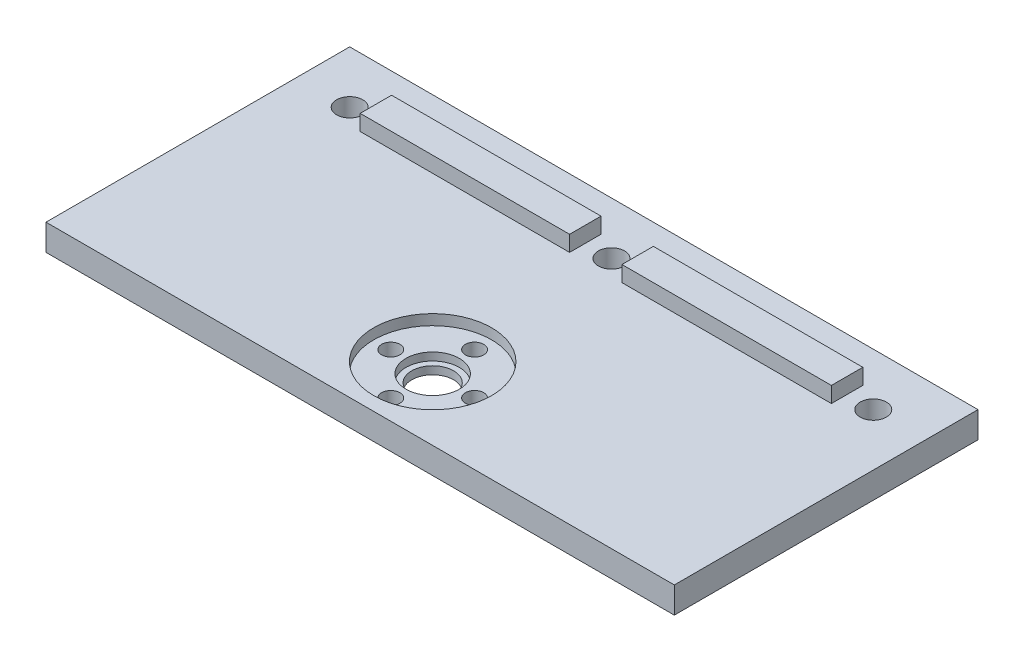
ISO-10303-21;
HEADER;
FILE_DESCRIPTION(('STEP AP214'),'2;1');
FILE_NAME('part.step','',(''),(''),'','','');
FILE_SCHEMA(('AUTOMOTIVE_DESIGN { 1 0 10303 214 1 1 1 1 }'));
ENDSEC;
DATA;
#1=APPLICATION_CONTEXT('core data for automotive mechanical design processes');
#2=APPLICATION_PROTOCOL_DEFINITION('international standard','automotive_design',2000,#1);
#3=PRODUCT_CONTEXT('',#1,'mechanical');
#4=PRODUCT('Part','Part','',(#3));
#5=PRODUCT_RELATED_PRODUCT_CATEGORY('part','',(#4));
#6=PRODUCT_DEFINITION_FORMATION('','',#4);
#7=PRODUCT_DEFINITION_CONTEXT('part definition',#1,'design');
#8=PRODUCT_DEFINITION('design','',#6,#7);
#9=PRODUCT_DEFINITION_SHAPE('','',#8);
#10=(LENGTH_UNIT() NAMED_UNIT(*) SI_UNIT(.MILLI.,.METRE.));
#11=(NAMED_UNIT(*) PLANE_ANGLE_UNIT() SI_UNIT($,.RADIAN.));
#12=(NAMED_UNIT(*) SI_UNIT($,.STERADIAN.) SOLID_ANGLE_UNIT());
#13=UNCERTAINTY_MEASURE_WITH_UNIT(LENGTH_MEASURE(1.E-05),#10,'distance_accuracy_value','');
#14=(GEOMETRIC_REPRESENTATION_CONTEXT(3) GLOBAL_UNCERTAINTY_ASSIGNED_CONTEXT((#13)) GLOBAL_UNIT_ASSIGNED_CONTEXT((#10,
#11,#12)) REPRESENTATION_CONTEXT('',''));
#15=CARTESIAN_POINT('',(0.,0.,0.));
#16=DIRECTION('',(0.,0.,1.));
#17=DIRECTION('',(1.,0.,0.));
#18=AXIS2_PLACEMENT_3D('',#15,#16,#17);
#19=CARTESIAN_POINT('',(60.,-9.,-13.85));
#20=DIRECTION('',(0.,1.,0.));
#21=DIRECTION('',(0.,0.,1.));
#22=AXIS2_PLACEMENT_3D('',#19,#20,#21);
#23=CYLINDRICAL_SURFACE('',#22,4.00000000000001);
#24=CARTESIAN_POINT('',(60.,0.,-13.85));
#25=DIRECTION('',(0.,-1.,0.));
#26=DIRECTION('',(0.,0.,-1.));
#27=AXIS2_PLACEMENT_3D('',#24,#25,#26);
#28=CIRCLE('',#27,4.00000000000001);
#29=CARTESIAN_POINT('',(60.,0.,-17.85));
#30=VERTEX_POINT('',#29);
#31=EDGE_CURVE('E226',#30,#30,#28,.T.);
#32=ORIENTED_EDGE('',*,*,#31,.T.);
#33=EDGE_LOOP('',(#32));
#34=FACE_BOUND('',#33,.T.);
#35=CARTESIAN_POINT('',(60.,1.5,-13.85));
#36=DIRECTION('',(0.,1.,0.));
#37=DIRECTION('',(0.,0.,1.));
#38=AXIS2_PLACEMENT_3D('',#35,#36,#37);
#39=CIRCLE('',#38,4.00000000000001);
#40=CARTESIAN_POINT('',(60.,1.5,-9.84999999999999));
#41=VERTEX_POINT('',#40);
#42=EDGE_CURVE('E37',#41,#41,#39,.F.);
#43=ORIENTED_EDGE('',*,*,#42,.F.);
#44=EDGE_LOOP('',(#43));
#45=FACE_BOUND('',#44,.T.);
#46=ADVANCED_FACE('F33',(#34,#45),#23,.F.);
#47=CARTESIAN_POINT('',(0.,5.,0.));
#48=DIRECTION('',(0.,-1.,0.));
#49=DIRECTION('',(0.,0.,-1.));
#50=AXIS2_PLACEMENT_3D('',#47,#48,#49);
#51=PLANE('',#50);
#52=CARTESIAN_POINT('',(60.,5.,-13.85));
#53=DIRECTION('',(0.,1.,0.));
#54=DIRECTION('',(0.,0.,1.));
#55=AXIS2_PLACEMENT_3D('',#52,#53,#54);
#56=CIRCLE('',#55,11.25);
#57=CARTESIAN_POINT('',(60.,5.,-2.60000000000001));
#58=VERTEX_POINT('',#57);
#59=EDGE_CURVE('E228',#58,#58,#56,.T.);
#60=ORIENTED_EDGE('',*,*,#59,.F.);
#61=EDGE_LOOP('',(#60));
#62=FACE_BOUND('',#61,.T.);
#63=DIRECTION('',(0.,0.,1.));
#64=VECTOR('',#63,1.);
#65=CARTESIAN_POINT('',(15.,5.,-45.));
#66=LINE('',#65,#64);
#67=CARTESIAN_POINT('',(15.,5.,-51.));
#68=VERTEX_POINT('',#67);
#69=CARTESIAN_POINT('',(15.,5.,-45.));
#70=VERTEX_POINT('',#69);
#71=EDGE_CURVE('E145',#68,#70,#66,.T.);
#72=ORIENTED_EDGE('',*,*,#71,.F.);
#73=DIRECTION('',(-1.,0.,0.));
#74=VECTOR('',#73,1.);
#75=CARTESIAN_POINT('',(15.,5.,-51.));
#76=LINE('',#75,#74);
#77=CARTESIAN_POINT('',(55.,5.,-51.));
#78=VERTEX_POINT('',#77);
#79=EDGE_CURVE('E158',#78,#68,#76,.T.);
#80=ORIENTED_EDGE('',*,*,#79,.F.);
#81=DIRECTION('',(0.,0.,-1.));
#82=VECTOR('',#81,1.);
#83=CARTESIAN_POINT('',(55.,5.,-45.));
#84=LINE('',#83,#82);
#85=CARTESIAN_POINT('',(55.,5.,-45.));
#86=VERTEX_POINT('',#85);
#87=EDGE_CURVE('E167',#86,#78,#84,.T.);
#88=ORIENTED_EDGE('',*,*,#87,.F.);
#89=DIRECTION('',(1.,0.,0.));
#90=VECTOR('',#89,1.);
#91=CARTESIAN_POINT('',(15.,5.,-45.));
#92=LINE('',#91,#90);
#93=EDGE_CURVE('E148',#70,#86,#92,.T.);
#94=ORIENTED_EDGE('',*,*,#93,.F.);
#95=EDGE_LOOP('',(#72,#80,#88,#94));
#96=FACE_BOUND('',#95,.T.);
#97=CARTESIAN_POINT('',(10.,5.,-48.));
#98=DIRECTION('',(0.,1.,0.));
#99=DIRECTION('',(0.,0.,1.));
#100=AXIS2_PLACEMENT_3D('',#97,#98,#99);
#101=CIRCLE('',#100,2.5);
#102=CARTESIAN_POINT('',(10.,5.,-45.5));
#103=VERTEX_POINT('',#102);
#104=EDGE_CURVE('E188',#103,#103,#101,.T.);
#105=ORIENTED_EDGE('',*,*,#104,.F.);
#106=EDGE_LOOP('',(#105));
#107=FACE_BOUND('',#106,.T.);
#108=CARTESIAN_POINT('',(60.,5.,-48.));
#109=DIRECTION('',(0.,1.,0.));
#110=DIRECTION('',(0.,0.,1.));
#111=AXIS2_PLACEMENT_3D('',#108,#109,#110);
#112=CIRCLE('',#111,2.5);
#113=CARTESIAN_POINT('',(60.,5.,-45.5));
#114=VERTEX_POINT('',#113);
#115=EDGE_CURVE('E194',#114,#114,#112,.T.);
#116=ORIENTED_EDGE('',*,*,#115,.F.);
#117=EDGE_LOOP('',(#116));
#118=FACE_BOUND('',#117,.T.);
#119=CARTESIAN_POINT('',(110.,5.,-48.));
#120=DIRECTION('',(0.,1.,0.));
#121=DIRECTION('',(0.,0.,1.));
#122=AXIS2_PLACEMENT_3D('',#119,#120,#121);
#123=CIRCLE('',#122,2.50000000000001);
#124=CARTESIAN_POINT('',(110.,5.,-45.5));
#125=VERTEX_POINT('',#124);
#126=EDGE_CURVE('E183',#125,#125,#123,.T.);
#127=ORIENTED_EDGE('',*,*,#126,.F.);
#128=EDGE_LOOP('',(#127));
#129=FACE_BOUND('',#128,.T.);
#130=DIRECTION('',(0.,0.,1.));
#131=VECTOR('',#130,1.);
#132=CARTESIAN_POINT('',(0.,5.,0.));
#133=LINE('',#132,#131);
#134=CARTESIAN_POINT('',(0.,5.,-58.));
#135=VERTEX_POINT('',#134);
#136=CARTESIAN_POINT('',(0.,5.,0.));
#137=VERTEX_POINT('',#136);
#138=EDGE_CURVE('E202',#135,#137,#133,.T.);
#139=ORIENTED_EDGE('',*,*,#138,.T.);
#140=DIRECTION('',(1.,0.,0.));
#141=VECTOR('',#140,1.);
#142=CARTESIAN_POINT('',(0.,5.,0.));
#143=LINE('',#142,#141);
#144=CARTESIAN_POINT('',(120.,5.,0.));
#145=VERTEX_POINT('',#144);
#146=EDGE_CURVE('E205',#137,#145,#143,.T.);
#147=ORIENTED_EDGE('',*,*,#146,.T.);
#148=DIRECTION('',(0.,0.,-1.));
#149=VECTOR('',#148,1.);
#150=CARTESIAN_POINT('',(120.,5.,0.));
#151=LINE('',#150,#149);
#152=CARTESIAN_POINT('',(120.,5.,-58.));
#153=VERTEX_POINT('',#152);
#154=EDGE_CURVE('E208',#145,#153,#151,.T.);
#155=ORIENTED_EDGE('',*,*,#154,.T.);
#156=DIRECTION('',(-1.,0.,0.));
#157=VECTOR('',#156,1.);
#158=CARTESIAN_POINT('',(0.,5.,-58.));
#159=LINE('',#158,#157);
#160=EDGE_CURVE('E210',#153,#135,#159,.T.);
#161=ORIENTED_EDGE('',*,*,#160,.T.);
#162=EDGE_LOOP('',(#139,#147,#155,#161));
#163=FACE_BOUND('',#162,.T.);
#164=DIRECTION('',(0.,0.,1.));
#165=VECTOR('',#164,1.);
#166=CARTESIAN_POINT('',(65.,5.,-45.));
#167=LINE('',#166,#165);
#168=CARTESIAN_POINT('',(65.,5.,-51.));
#169=VERTEX_POINT('',#168);
#170=CARTESIAN_POINT('',(65.,5.,-45.));
#171=VERTEX_POINT('',#170);
#172=EDGE_CURVE('E144',#169,#171,#167,.T.);
#173=ORIENTED_EDGE('',*,*,#172,.F.);
#174=DIRECTION('',(-1.,0.,0.));
#175=VECTOR('',#174,1.);
#176=CARTESIAN_POINT('',(65.,5.,-51.));
#177=LINE('',#176,#175);
#178=CARTESIAN_POINT('',(105.,5.,-51.));
#179=VERTEX_POINT('',#178);
#180=EDGE_CURVE('E141',#179,#169,#177,.T.);
#181=ORIENTED_EDGE('',*,*,#180,.F.);
#182=DIRECTION('',(0.,0.,-1.));
#183=VECTOR('',#182,1.);
#184=CARTESIAN_POINT('',(105.,5.,-45.));
#185=LINE('',#184,#183);
#186=CARTESIAN_POINT('',(105.,5.,-45.));
#187=VERTEX_POINT('',#186);
#188=EDGE_CURVE('E55',#187,#179,#185,.T.);
#189=ORIENTED_EDGE('',*,*,#188,.F.);
#190=DIRECTION('',(1.,0.,0.));
#191=VECTOR('',#190,1.);
#192=CARTESIAN_POINT('',(65.,5.,-45.));
#193=LINE('',#192,#191);
#194=EDGE_CURVE('E50',#171,#187,#193,.T.);
#195=ORIENTED_EDGE('',*,*,#194,.F.);
#196=EDGE_LOOP('',(#173,#181,#189,#195));
#197=FACE_BOUND('',#196,.T.);
#198=ADVANCED_FACE('F274',(#62,#96,#107,#118,#129,#163,#197),#51,.F.);
#199=CARTESIAN_POINT('',(0.,5.,0.));
#200=DIRECTION('',(1.,0.,0.));
#201=DIRECTION('',(0.,0.,-1.));
#202=AXIS2_PLACEMENT_3D('',#199,#200,#201);
#203=PLANE('',#202);
#204=DIRECTION('',(0.,0.,1.));
#205=VECTOR('',#204,1.);
#206=CARTESIAN_POINT('',(0.,0.,0.));
#207=LINE('',#206,#205);
#208=CARTESIAN_POINT('',(0.,0.,-58.));
#209=VERTEX_POINT('',#208);
#210=CARTESIAN_POINT('',(0.,0.,0.));
#211=VERTEX_POINT('',#210);
#212=EDGE_CURVE('E187',#209,#211,#207,.T.);
#213=ORIENTED_EDGE('',*,*,#212,.T.);
#214=DIRECTION('',(0.,-1.,0.));
#215=VECTOR('',#214,1.);
#216=CARTESIAN_POINT('',(0.,5.,0.));
#217=LINE('',#216,#215);
#218=EDGE_CURVE('E11',#137,#211,#217,.T.);
#219=ORIENTED_EDGE('',*,*,#218,.F.);
#220=ORIENTED_EDGE('',*,*,#138,.F.);
#221=DIRECTION('',(0.,-1.,0.));
#222=VECTOR('',#221,1.);
#223=CARTESIAN_POINT('',(0.,5.,-58.));
#224=LINE('',#223,#222);
#225=EDGE_CURVE('E212',#135,#209,#224,.T.);
#226=ORIENTED_EDGE('',*,*,#225,.T.);
#227=EDGE_LOOP('',(#213,#219,#220,#226));
#228=FACE_BOUND('',#227,.T.);
#229=ADVANCED_FACE('F35',(#228),#203,.F.);
#230=CARTESIAN_POINT('',(0.,5.,0.));
#231=DIRECTION('',(0.,0.,-1.));
#232=DIRECTION('',(-1.,0.,0.));
#233=AXIS2_PLACEMENT_3D('',#230,#231,#232);
#234=PLANE('',#233);
#235=DIRECTION('',(1.,0.,0.));
#236=VECTOR('',#235,1.);
#237=CARTESIAN_POINT('',(0.,0.,0.));
#238=LINE('',#237,#236);
#239=CARTESIAN_POINT('',(120.,0.,0.));
#240=VERTEX_POINT('',#239);
#241=EDGE_CURVE('E215',#211,#240,#238,.T.);
#242=ORIENTED_EDGE('',*,*,#241,.T.);
#243=DIRECTION('',(0.,-1.,0.));
#244=VECTOR('',#243,1.);
#245=CARTESIAN_POINT('',(120.,5.,0.));
#246=LINE('',#245,#244);
#247=EDGE_CURVE('E42',#145,#240,#246,.T.);
#248=ORIENTED_EDGE('',*,*,#247,.F.);
#249=ORIENTED_EDGE('',*,*,#146,.F.);
#250=ORIENTED_EDGE('',*,*,#218,.T.);
#251=EDGE_LOOP('',(#242,#248,#249,#250));
#252=FACE_BOUND('',#251,.T.);
#253=ADVANCED_FACE('F497',(#252),#234,.F.);
#254=CARTESIAN_POINT('',(120.,5.,0.));
#255=DIRECTION('',(-1.,0.,0.));
#256=DIRECTION('',(0.,0.,1.));
#257=AXIS2_PLACEMENT_3D('',#254,#255,#256);
#258=PLANE('',#257);
#259=DIRECTION('',(0.,0.,-1.));
#260=VECTOR('',#259,1.);
#261=CARTESIAN_POINT('',(120.,0.,0.));
#262=LINE('',#261,#260);
#263=CARTESIAN_POINT('',(120.,0.,-58.));
#264=VERTEX_POINT('',#263);
#265=EDGE_CURVE('E217',#240,#264,#262,.T.);
#266=ORIENTED_EDGE('',*,*,#265,.T.);
#267=DIRECTION('',(0.,-1.,0.));
#268=VECTOR('',#267,1.);
#269=CARTESIAN_POINT('',(120.,5.,-58.));
#270=LINE('',#269,#268);
#271=EDGE_CURVE('E222',#153,#264,#270,.T.);
#272=ORIENTED_EDGE('',*,*,#271,.F.);
#273=ORIENTED_EDGE('',*,*,#154,.F.);
#274=ORIENTED_EDGE('',*,*,#247,.T.);
#275=EDGE_LOOP('',(#266,#272,#273,#274));
#276=FACE_BOUND('',#275,.T.);
#277=ADVANCED_FACE('F488',(#276),#258,.F.);
#278=CARTESIAN_POINT('',(0.,5.,-58.));
#279=DIRECTION('',(0.,0.,1.));
#280=DIRECTION('',(1.,0.,0.));
#281=AXIS2_PLACEMENT_3D('',#278,#279,#280);
#282=PLANE('',#281);
#283=DIRECTION('',(-1.,0.,0.));
#284=VECTOR('',#283,1.);
#285=CARTESIAN_POINT('',(0.,0.,-58.));
#286=LINE('',#285,#284);
#287=EDGE_CURVE('E206',#264,#209,#286,.T.);
#288=ORIENTED_EDGE('',*,*,#287,.T.);
#289=ORIENTED_EDGE('',*,*,#225,.F.);
#290=ORIENTED_EDGE('',*,*,#160,.F.);
#291=ORIENTED_EDGE('',*,*,#271,.T.);
#292=EDGE_LOOP('',(#288,#289,#290,#291));
#293=FACE_BOUND('',#292,.T.);
#294=ADVANCED_FACE('F480',(#293),#282,.F.);
#295=CARTESIAN_POINT('',(0.,0.,0.));
#296=DIRECTION('',(0.,-1.,0.));
#297=DIRECTION('',(0.,0.,-1.));
#298=AXIS2_PLACEMENT_3D('',#295,#296,#297);
#299=PLANE('',#298);
#300=CARTESIAN_POINT('',(52.,0.,-13.85));
#301=DIRECTION('',(0.,-1.,0.));
#302=DIRECTION('',(0.,0.,-1.));
#303=AXIS2_PLACEMENT_3D('',#300,#301,#302);
#304=CIRCLE('',#303,1.75);
#305=CARTESIAN_POINT('',(52.,0.,-15.6));
#306=VERTEX_POINT('',#305);
#307=EDGE_CURVE('E244',#306,#306,#304,.T.);
#308=ORIENTED_EDGE('',*,*,#307,.F.);
#309=EDGE_LOOP('',(#308));
#310=FACE_BOUND('',#309,.T.);
#311=CARTESIAN_POINT('',(60.,0.,-21.85));
#312=DIRECTION('',(0.,-1.,0.));
#313=DIRECTION('',(0.,0.,-1.));
#314=AXIS2_PLACEMENT_3D('',#311,#312,#313);
#315=CIRCLE('',#314,1.75);
#316=CARTESIAN_POINT('',(60.,0.,-23.6));
#317=VERTEX_POINT('',#316);
#318=EDGE_CURVE('E548',#317,#317,#315,.T.);
#319=ORIENTED_EDGE('',*,*,#318,.F.);
#320=EDGE_LOOP('',(#319));
#321=FACE_BOUND('',#320,.T.);
#322=CARTESIAN_POINT('',(68.,0.,-13.85));
#323=DIRECTION('',(0.,-1.,0.));
#324=DIRECTION('',(0.,0.,-1.));
#325=AXIS2_PLACEMENT_3D('',#322,#323,#324);
#326=CIRCLE('',#325,1.75);
#327=CARTESIAN_POINT('',(68.,0.,-15.6));
#328=VERTEX_POINT('',#327);
#329=EDGE_CURVE('E552',#328,#328,#326,.T.);
#330=ORIENTED_EDGE('',*,*,#329,.F.);
#331=EDGE_LOOP('',(#330));
#332=FACE_BOUND('',#331,.T.);
#333=CARTESIAN_POINT('',(60.,0.,-5.85));
#334=DIRECTION('',(0.,-1.,0.));
#335=DIRECTION('',(0.,0.,-1.));
#336=AXIS2_PLACEMENT_3D('',#333,#334,#335);
#337=CIRCLE('',#336,1.75);
#338=CARTESIAN_POINT('',(60.,0.,-7.6));
#339=VERTEX_POINT('',#338);
#340=EDGE_CURVE('E556',#339,#339,#337,.T.);
#341=ORIENTED_EDGE('',*,*,#340,.F.);
#342=EDGE_LOOP('',(#341));
#343=FACE_BOUND('',#342,.T.);
#344=ORIENTED_EDGE('',*,*,#31,.F.);
#345=EDGE_LOOP('',(#344));
#346=FACE_BOUND('',#345,.T.);
#347=CARTESIAN_POINT('',(10.,0.,-48.));
#348=DIRECTION('',(0.,1.,0.));
#349=DIRECTION('',(0.,0.,1.));
#350=AXIS2_PLACEMENT_3D('',#347,#348,#349);
#351=CIRCLE('',#350,2.5);
#352=CARTESIAN_POINT('',(10.,0.,-45.5));
#353=VERTEX_POINT('',#352);
#354=EDGE_CURVE('E184',#353,#353,#351,.T.);
#355=ORIENTED_EDGE('',*,*,#354,.T.);
#356=EDGE_LOOP('',(#355));
#357=FACE_BOUND('',#356,.T.);
#358=CARTESIAN_POINT('',(60.,0.,-48.));
#359=DIRECTION('',(0.,1.,0.));
#360=DIRECTION('',(0.,0.,1.));
#361=AXIS2_PLACEMENT_3D('',#358,#359,#360);
#362=CIRCLE('',#361,2.5);
#363=CARTESIAN_POINT('',(60.,0.,-45.5));
#364=VERTEX_POINT('',#363);
#365=EDGE_CURVE('E191',#364,#364,#362,.T.);
#366=ORIENTED_EDGE('',*,*,#365,.T.);
#367=EDGE_LOOP('',(#366));
#368=FACE_BOUND('',#367,.T.);
#369=CARTESIAN_POINT('',(110.,0.,-48.));
#370=DIRECTION('',(0.,1.,0.));
#371=DIRECTION('',(0.,0.,1.));
#372=AXIS2_PLACEMENT_3D('',#369,#370,#371);
#373=CIRCLE('',#372,2.50000000000001);
#374=CARTESIAN_POINT('',(110.,0.,-45.5));
#375=VERTEX_POINT('',#374);
#376=EDGE_CURVE('E197',#375,#375,#373,.T.);
#377=ORIENTED_EDGE('',*,*,#376,.T.);
#378=EDGE_LOOP('',(#377));
#379=FACE_BOUND('',#378,.T.);
#380=ORIENTED_EDGE('',*,*,#212,.F.);
#381=ORIENTED_EDGE('',*,*,#287,.F.);
#382=ORIENTED_EDGE('',*,*,#265,.F.);
#383=ORIENTED_EDGE('',*,*,#241,.F.);
#384=EDGE_LOOP('',(#380,#381,#382,#383));
#385=FACE_BOUND('',#384,.T.);
#386=ADVANCED_FACE('F471',(#310,#321,#332,#343,#346,#357,#368,#379,#385),#299,.T.);
#387=CARTESIAN_POINT('',(110.,0.,-48.));
#388=DIRECTION('',(0.,1.,0.));
#389=DIRECTION('',(0.,0.,1.));
#390=AXIS2_PLACEMENT_3D('',#387,#388,#389);
#391=CYLINDRICAL_SURFACE('',#390,2.50000000000001);
#392=ORIENTED_EDGE('',*,*,#376,.F.);
#393=EDGE_LOOP('',(#392));
#394=FACE_BOUND('',#393,.T.);
#395=ORIENTED_EDGE('',*,*,#126,.T.);
#396=EDGE_LOOP('',(#395));
#397=FACE_BOUND('',#396,.T.);
#398=ADVANCED_FACE('F462',(#394,#397),#391,.F.);
#399=CARTESIAN_POINT('',(60.,0.,-48.));
#400=DIRECTION('',(0.,1.,0.));
#401=DIRECTION('',(0.,0.,1.));
#402=AXIS2_PLACEMENT_3D('',#399,#400,#401);
#403=CYLINDRICAL_SURFACE('',#402,2.5);
#404=ORIENTED_EDGE('',*,*,#365,.F.);
#405=EDGE_LOOP('',(#404));
#406=FACE_BOUND('',#405,.T.);
#407=ORIENTED_EDGE('',*,*,#115,.T.);
#408=EDGE_LOOP('',(#407));
#409=FACE_BOUND('',#408,.T.);
#410=ADVANCED_FACE('F453',(#406,#409),#403,.F.);
#411=CARTESIAN_POINT('',(10.,0.,-48.));
#412=DIRECTION('',(0.,1.,0.));
#413=DIRECTION('',(0.,0.,1.));
#414=AXIS2_PLACEMENT_3D('',#411,#412,#413);
#415=CYLINDRICAL_SURFACE('',#414,2.5);
#416=ORIENTED_EDGE('',*,*,#354,.F.);
#417=EDGE_LOOP('',(#416));
#418=FACE_BOUND('',#417,.T.);
#419=ORIENTED_EDGE('',*,*,#104,.T.);
#420=EDGE_LOOP('',(#419));
#421=FACE_BOUND('',#420,.T.);
#422=ADVANCED_FACE('F440',(#418,#421),#415,.F.);
#423=CARTESIAN_POINT('',(15.,8.,-45.));
#424=DIRECTION('',(1.,0.,0.));
#425=DIRECTION('',(0.,0.,-1.));
#426=AXIS2_PLACEMENT_3D('',#423,#424,#425);
#427=PLANE('',#426);
#428=ORIENTED_EDGE('',*,*,#71,.T.);
#429=DIRECTION('',(0.,-1.,0.));
#430=VECTOR('',#429,1.);
#431=CARTESIAN_POINT('',(15.,8.,-45.));
#432=LINE('',#431,#430);
#433=CARTESIAN_POINT('',(15.,8.,-45.));
#434=VERTEX_POINT('',#433);
#435=EDGE_CURVE('E180',#434,#70,#432,.T.);
#436=ORIENTED_EDGE('',*,*,#435,.F.);
#437=DIRECTION('',(0.,0.,1.));
#438=VECTOR('',#437,1.);
#439=CARTESIAN_POINT('',(15.,8.,-45.));
#440=LINE('',#439,#438);
#441=CARTESIAN_POINT('',(15.,8.,-51.));
#442=VERTEX_POINT('',#441);
#443=EDGE_CURVE('E154',#442,#434,#440,.T.);
#444=ORIENTED_EDGE('',*,*,#443,.F.);
#445=DIRECTION('',(0.,-1.,0.));
#446=VECTOR('',#445,1.);
#447=CARTESIAN_POINT('',(15.,8.,-51.));
#448=LINE('',#447,#446);
#449=EDGE_CURVE('E163',#442,#68,#448,.T.);
#450=ORIENTED_EDGE('',*,*,#449,.T.);
#451=EDGE_LOOP('',(#428,#436,#444,#450));
#452=FACE_BOUND('',#451,.T.);
#453=ADVANCED_FACE('F431',(#452),#427,.F.);
#454=CARTESIAN_POINT('',(15.,8.,-45.));
#455=DIRECTION('',(0.,0.,-1.));
#456=DIRECTION('',(-1.,0.,0.));
#457=AXIS2_PLACEMENT_3D('',#454,#455,#456);
#458=PLANE('',#457);
#459=ORIENTED_EDGE('',*,*,#93,.T.);
#460=DIRECTION('',(0.,-1.,0.));
#461=VECTOR('',#460,1.);
#462=CARTESIAN_POINT('',(55.,8.,-45.));
#463=LINE('',#462,#461);
#464=CARTESIAN_POINT('',(55.,8.,-45.));
#465=VERTEX_POINT('',#464);
#466=EDGE_CURVE('E177',#465,#86,#463,.T.);
#467=ORIENTED_EDGE('',*,*,#466,.F.);
#468=DIRECTION('',(1.,0.,0.));
#469=VECTOR('',#468,1.);
#470=CARTESIAN_POINT('',(15.,8.,-45.));
#471=LINE('',#470,#469);
#472=EDGE_CURVE('E157',#434,#465,#471,.T.);
#473=ORIENTED_EDGE('',*,*,#472,.F.);
#474=ORIENTED_EDGE('',*,*,#435,.T.);
#475=EDGE_LOOP('',(#459,#467,#473,#474));
#476=FACE_BOUND('',#475,.T.);
#477=ADVANCED_FACE('F422',(#476),#458,.F.);
#478=CARTESIAN_POINT('',(55.,8.,-45.));
#479=DIRECTION('',(-1.,0.,0.));
#480=DIRECTION('',(0.,0.,1.));
#481=AXIS2_PLACEMENT_3D('',#478,#479,#480);
#482=PLANE('',#481);
#483=ORIENTED_EDGE('',*,*,#87,.T.);
#484=DIRECTION('',(0.,-1.,0.));
#485=VECTOR('',#484,1.);
#486=CARTESIAN_POINT('',(55.,8.,-51.));
#487=LINE('',#486,#485);
#488=CARTESIAN_POINT('',(55.,8.,-51.));
#489=VERTEX_POINT('',#488);
#490=EDGE_CURVE('E174',#489,#78,#487,.T.);
#491=ORIENTED_EDGE('',*,*,#490,.F.);
#492=DIRECTION('',(0.,0.,-1.));
#493=VECTOR('',#492,1.);
#494=CARTESIAN_POINT('',(55.,8.,-45.));
#495=LINE('',#494,#493);
#496=EDGE_CURVE('E160',#465,#489,#495,.T.);
#497=ORIENTED_EDGE('',*,*,#496,.F.);
#498=ORIENTED_EDGE('',*,*,#466,.T.);
#499=EDGE_LOOP('',(#483,#491,#497,#498));
#500=FACE_BOUND('',#499,.T.);
#501=ADVANCED_FACE('F413',(#500),#482,.F.);
#502=CARTESIAN_POINT('',(15.,8.,-51.));
#503=DIRECTION('',(0.,0.,1.));
#504=DIRECTION('',(1.,0.,0.));
#505=AXIS2_PLACEMENT_3D('',#502,#503,#504);
#506=PLANE('',#505);
#507=ORIENTED_EDGE('',*,*,#79,.T.);
#508=ORIENTED_EDGE('',*,*,#449,.F.);
#509=DIRECTION('',(-1.,0.,0.));
#510=VECTOR('',#509,1.);
#511=CARTESIAN_POINT('',(15.,8.,-51.));
#512=LINE('',#511,#510);
#513=EDGE_CURVE('E162',#489,#442,#512,.T.);
#514=ORIENTED_EDGE('',*,*,#513,.F.);
#515=ORIENTED_EDGE('',*,*,#490,.T.);
#516=EDGE_LOOP('',(#507,#508,#514,#515));
#517=FACE_BOUND('',#516,.T.);
#518=ADVANCED_FACE('F404',(#517),#506,.F.);
#519=CARTESIAN_POINT('',(0.,8.,0.));
#520=DIRECTION('',(0.,-1.,0.));
#521=DIRECTION('',(0.,0.,-1.));
#522=AXIS2_PLACEMENT_3D('',#519,#520,#521);
#523=PLANE('',#522);
#524=ORIENTED_EDGE('',*,*,#443,.T.);
#525=ORIENTED_EDGE('',*,*,#472,.T.);
#526=ORIENTED_EDGE('',*,*,#496,.T.);
#527=ORIENTED_EDGE('',*,*,#513,.T.);
#528=EDGE_LOOP('',(#524,#525,#526,#527));
#529=FACE_BOUND('',#528,.T.);
#530=ADVANCED_FACE('F396',(#529),#523,.F.);
#531=CARTESIAN_POINT('',(65.,8.,-45.));
#532=DIRECTION('',(1.,0.,0.));
#533=DIRECTION('',(0.,0.,-1.));
#534=AXIS2_PLACEMENT_3D('',#531,#532,#533);
#535=PLANE('',#534);
#536=ORIENTED_EDGE('',*,*,#172,.T.);
#537=DIRECTION('',(0.,-1.,0.));
#538=VECTOR('',#537,1.);
#539=CARTESIAN_POINT('',(65.,8.,-45.));
#540=LINE('',#539,#538);
#541=CARTESIAN_POINT('',(65.,8.,-45.));
#542=VERTEX_POINT('',#541);
#543=EDGE_CURVE('E125',#542,#171,#540,.T.);
#544=ORIENTED_EDGE('',*,*,#543,.F.);
#545=DIRECTION('',(0.,0.,1.));
#546=VECTOR('',#545,1.);
#547=CARTESIAN_POINT('',(65.,8.,-45.));
#548=LINE('',#547,#546);
#549=CARTESIAN_POINT('',(65.,8.,-51.));
#550=VERTEX_POINT('',#549);
#551=EDGE_CURVE('E132',#550,#542,#548,.T.);
#552=ORIENTED_EDGE('',*,*,#551,.F.);
#553=DIRECTION('',(0.,-1.,0.));
#554=VECTOR('',#553,1.);
#555=CARTESIAN_POINT('',(65.,8.,-51.));
#556=LINE('',#555,#554);
#557=EDGE_CURVE('E253',#550,#169,#556,.T.);
#558=ORIENTED_EDGE('',*,*,#557,.T.);
#559=EDGE_LOOP('',(#536,#544,#552,#558));
#560=FACE_BOUND('',#559,.T.);
#561=ADVANCED_FACE('F143',(#560),#535,.F.);
#562=CARTESIAN_POINT('',(65.,8.,-45.));
#563=DIRECTION('',(0.,0.,-1.));
#564=DIRECTION('',(-1.,0.,0.));
#565=AXIS2_PLACEMENT_3D('',#562,#563,#564);
#566=PLANE('',#565);
#567=ORIENTED_EDGE('',*,*,#194,.T.);
#568=DIRECTION('',(0.,-1.,0.));
#569=VECTOR('',#568,1.);
#570=CARTESIAN_POINT('',(105.,8.,-45.));
#571=LINE('',#570,#569);
#572=CARTESIAN_POINT('',(105.,8.,-45.));
#573=VERTEX_POINT('',#572);
#574=EDGE_CURVE('E128',#573,#187,#571,.T.);
#575=ORIENTED_EDGE('',*,*,#574,.F.);
#576=DIRECTION('',(1.,0.,0.));
#577=VECTOR('',#576,1.);
#578=CARTESIAN_POINT('',(65.,8.,-45.));
#579=LINE('',#578,#577);
#580=EDGE_CURVE('E121',#542,#573,#579,.T.);
#581=ORIENTED_EDGE('',*,*,#580,.F.);
#582=ORIENTED_EDGE('',*,*,#543,.T.);
#583=EDGE_LOOP('',(#567,#575,#581,#582));
#584=FACE_BOUND('',#583,.T.);
#585=ADVANCED_FACE('F123',(#584),#566,.F.);
#586=CARTESIAN_POINT('',(105.,8.,-45.));
#587=DIRECTION('',(-1.,0.,0.));
#588=DIRECTION('',(0.,0.,1.));
#589=AXIS2_PLACEMENT_3D('',#586,#587,#588);
#590=PLANE('',#589);
#591=ORIENTED_EDGE('',*,*,#188,.T.);
#592=DIRECTION('',(0.,-1.,0.));
#593=VECTOR('',#592,1.);
#594=CARTESIAN_POINT('',(105.,8.,-51.));
#595=LINE('',#594,#593);
#596=CARTESIAN_POINT('',(105.,8.,-51.));
#597=VERTEX_POINT('',#596);
#598=EDGE_CURVE('E150',#597,#179,#595,.T.);
#599=ORIENTED_EDGE('',*,*,#598,.F.);
#600=DIRECTION('',(0.,0.,-1.));
#601=VECTOR('',#600,1.);
#602=CARTESIAN_POINT('',(105.,8.,-45.));
#603=LINE('',#602,#601);
#604=EDGE_CURVE('E131',#573,#597,#603,.T.);
#605=ORIENTED_EDGE('',*,*,#604,.F.);
#606=ORIENTED_EDGE('',*,*,#574,.T.);
#607=EDGE_LOOP('',(#591,#599,#605,#606));
#608=FACE_BOUND('',#607,.T.);
#609=ADVANCED_FACE('F264',(#608),#590,.F.);
#610=CARTESIAN_POINT('',(65.,8.,-51.));
#611=DIRECTION('',(0.,0.,1.));
#612=DIRECTION('',(1.,0.,0.));
#613=AXIS2_PLACEMENT_3D('',#610,#611,#612);
#614=PLANE('',#613);
#615=ORIENTED_EDGE('',*,*,#180,.T.);
#616=ORIENTED_EDGE('',*,*,#557,.F.);
#617=DIRECTION('',(-1.,0.,0.));
#618=VECTOR('',#617,1.);
#619=CARTESIAN_POINT('',(65.,8.,-51.));
#620=LINE('',#619,#618);
#621=EDGE_CURVE('E137',#597,#550,#620,.T.);
#622=ORIENTED_EDGE('',*,*,#621,.F.);
#623=ORIENTED_EDGE('',*,*,#598,.T.);
#624=EDGE_LOOP('',(#615,#616,#622,#623));
#625=FACE_BOUND('',#624,.T.);
#626=ADVANCED_FACE('F262',(#625),#614,.F.);
#627=CARTESIAN_POINT('',(0.,8.,0.));
#628=DIRECTION('',(0.,-1.,0.));
#629=DIRECTION('',(0.,0.,-1.));
#630=AXIS2_PLACEMENT_3D('',#627,#628,#629);
#631=PLANE('',#630);
#632=ORIENTED_EDGE('',*,*,#551,.T.);
#633=ORIENTED_EDGE('',*,*,#580,.T.);
#634=ORIENTED_EDGE('',*,*,#604,.T.);
#635=ORIENTED_EDGE('',*,*,#621,.T.);
#636=EDGE_LOOP('',(#632,#633,#634,#635));
#637=FACE_BOUND('',#636,.T.);
#638=ADVANCED_FACE('F135',(#637),#631,.F.);
#639=CARTESIAN_POINT('',(60.,3.,-13.85));
#640=DIRECTION('',(0.,1.,0.));
#641=DIRECTION('',(0.,0.,1.));
#642=AXIS2_PLACEMENT_3D('',#639,#640,#641);
#643=CYLINDRICAL_SURFACE('',#642,11.25);
#644=CARTESIAN_POINT('',(60.,3.,-13.85));
#645=DIRECTION('',(0.,1.,0.));
#646=DIRECTION('',(0.,0.,1.));
#647=AXIS2_PLACEMENT_3D('',#644,#645,#646);
#648=CIRCLE('',#647,11.25);
#649=CARTESIAN_POINT('',(60.,3.,-2.60000000000001));
#650=VERTEX_POINT('',#649);
#651=EDGE_CURVE('E232',#650,#650,#648,.T.);
#652=ORIENTED_EDGE('',*,*,#651,.F.);
#653=EDGE_LOOP('',(#652));
#654=FACE_BOUND('',#653,.T.);
#655=ORIENTED_EDGE('',*,*,#59,.T.);
#656=EDGE_LOOP('',(#655));
#657=FACE_BOUND('',#656,.T.);
#658=ADVANCED_FACE('F290',(#654,#657),#643,.F.);
#659=CARTESIAN_POINT('',(60.,3.,-13.85));
#660=DIRECTION('',(0.,1.,0.));
#661=DIRECTION('',(0.,0.,1.));
#662=AXIS2_PLACEMENT_3D('',#659,#660,#661);
#663=PLANE('',#662);
#664=CARTESIAN_POINT('',(52.,3.,-13.85));
#665=DIRECTION('',(0.,1.,0.));
#666=DIRECTION('',(0.,0.,1.));
#667=AXIS2_PLACEMENT_3D('',#664,#665,#666);
#668=CIRCLE('',#667,1.75);
#669=CARTESIAN_POINT('',(52.,3.,-12.1));
#670=VERTEX_POINT('',#669);
#671=EDGE_CURVE('E572',#670,#670,#668,.T.);
#672=ORIENTED_EDGE('',*,*,#671,.F.);
#673=EDGE_LOOP('',(#672));
#674=FACE_BOUND('',#673,.T.);
#675=CARTESIAN_POINT('',(60.,3.,-21.85));
#676=DIRECTION('',(0.,1.,0.));
#677=DIRECTION('',(0.,0.,1.));
#678=AXIS2_PLACEMENT_3D('',#675,#676,#677);
#679=CIRCLE('',#678,1.75);
#680=CARTESIAN_POINT('',(60.,3.,-20.1));
#681=VERTEX_POINT('',#680);
#682=EDGE_CURVE('E576',#681,#681,#679,.T.);
#683=ORIENTED_EDGE('',*,*,#682,.F.);
#684=EDGE_LOOP('',(#683));
#685=FACE_BOUND('',#684,.T.);
#686=CARTESIAN_POINT('',(68.,3.,-13.85));
#687=DIRECTION('',(0.,1.,0.));
#688=DIRECTION('',(0.,0.,1.));
#689=AXIS2_PLACEMENT_3D('',#686,#687,#688);
#690=CIRCLE('',#689,1.75);
#691=CARTESIAN_POINT('',(68.,3.,-12.1));
#692=VERTEX_POINT('',#691);
#693=EDGE_CURVE('E590',#692,#692,#690,.T.);
#694=ORIENTED_EDGE('',*,*,#693,.F.);
#695=EDGE_LOOP('',(#694));
#696=FACE_BOUND('',#695,.T.);
#697=CARTESIAN_POINT('',(60.,3.,-5.85));
#698=DIRECTION('',(0.,1.,0.));
#699=DIRECTION('',(0.,0.,1.));
#700=AXIS2_PLACEMENT_3D('',#697,#698,#699);
#701=CIRCLE('',#700,1.75);
#702=CARTESIAN_POINT('',(60.,3.,-4.1));
#703=VERTEX_POINT('',#702);
#704=EDGE_CURVE('E579',#703,#703,#701,.T.);
#705=ORIENTED_EDGE('',*,*,#704,.F.);
#706=EDGE_LOOP('',(#705));
#707=FACE_BOUND('',#706,.T.);
#708=CARTESIAN_POINT('',(60.,3.,-13.85));
#709=DIRECTION('',(0.,1.,0.));
#710=DIRECTION('',(0.,0.,1.));
#711=AXIS2_PLACEMENT_3D('',#708,#709,#710);
#712=CIRCLE('',#711,5.1);
#713=CARTESIAN_POINT('',(60.,3.,-8.75));
#714=VERTEX_POINT('',#713);
#715=EDGE_CURVE('E239',#714,#714,#712,.T.);
#716=ORIENTED_EDGE('',*,*,#715,.F.);
#717=EDGE_LOOP('',(#716));
#718=FACE_BOUND('',#717,.T.);
#719=ORIENTED_EDGE('',*,*,#651,.T.);
#720=EDGE_LOOP('',(#719));
#721=FACE_BOUND('',#720,.T.);
#722=ADVANCED_FACE('F286',(#674,#685,#696,#707,#718,#721),#663,.T.);
#723=CARTESIAN_POINT('',(60.,1.5,-13.85));
#724=DIRECTION('',(0.,1.,0.));
#725=DIRECTION('',(0.,0.,1.));
#726=AXIS2_PLACEMENT_3D('',#723,#724,#725);
#727=PLANE('',#726);
#728=CARTESIAN_POINT('',(60.,1.5,-13.85));
#729=DIRECTION('',(0.,1.,0.));
#730=DIRECTION('',(0.,0.,1.));
#731=AXIS2_PLACEMENT_3D('',#728,#729,#730);
#732=CIRCLE('',#731,5.1);
#733=CARTESIAN_POINT('',(60.,1.5,-8.75));
#734=VERTEX_POINT('',#733);
#735=EDGE_CURVE('E235',#734,#734,#732,.T.);
#736=ORIENTED_EDGE('',*,*,#735,.T.);
#737=EDGE_LOOP('',(#736));
#738=FACE_BOUND('',#737,.T.);
#739=ORIENTED_EDGE('',*,*,#42,.T.);
#740=EDGE_LOOP('',(#739));
#741=FACE_BOUND('',#740,.T.);
#742=ADVANCED_FACE('F289',(#738,#741),#727,.T.);
#743=CARTESIAN_POINT('',(60.,1.5,-13.85));
#744=DIRECTION('',(0.,1.,0.));
#745=DIRECTION('',(0.,0.,1.));
#746=AXIS2_PLACEMENT_3D('',#743,#744,#745);
#747=CYLINDRICAL_SURFACE('',#746,5.1);
#748=ORIENTED_EDGE('',*,*,#735,.F.);
#749=EDGE_LOOP('',(#748));
#750=FACE_BOUND('',#749,.T.);
#751=ORIENTED_EDGE('',*,*,#715,.T.);
#752=EDGE_LOOP('',(#751));
#753=FACE_BOUND('',#752,.T.);
#754=ADVANCED_FACE('F284',(#750,#753),#747,.F.);
#755=CARTESIAN_POINT('',(60.,-18.5,-5.85));
#756=DIRECTION('',(0.,1.,0.));
#757=DIRECTION('',(0.,0.,1.));
#758=AXIS2_PLACEMENT_3D('',#755,#756,#757);
#759=CYLINDRICAL_SURFACE('',#758,1.75);
#760=ORIENTED_EDGE('',*,*,#340,.T.);
#761=EDGE_LOOP('',(#760));
#762=FACE_BOUND('',#761,.T.);
#763=ORIENTED_EDGE('',*,*,#704,.T.);
#764=EDGE_LOOP('',(#763));
#765=FACE_BOUND('',#764,.T.);
#766=ADVANCED_FACE('F322',(#762,#765),#759,.F.);
#767=CARTESIAN_POINT('',(68.,-18.5,-13.85));
#768=DIRECTION('',(0.,1.,0.));
#769=DIRECTION('',(0.,0.,1.));
#770=AXIS2_PLACEMENT_3D('',#767,#768,#769);
#771=CYLINDRICAL_SURFACE('',#770,1.75);
#772=ORIENTED_EDGE('',*,*,#329,.T.);
#773=EDGE_LOOP('',(#772));
#774=FACE_BOUND('',#773,.T.);
#775=ORIENTED_EDGE('',*,*,#693,.T.);
#776=EDGE_LOOP('',(#775));
#777=FACE_BOUND('',#776,.T.);
#778=ADVANCED_FACE('F328',(#774,#777),#771,.F.);
#779=CARTESIAN_POINT('',(60.,-18.5,-21.85));
#780=DIRECTION('',(0.,1.,0.));
#781=DIRECTION('',(0.,0.,1.));
#782=AXIS2_PLACEMENT_3D('',#779,#780,#781);
#783=CYLINDRICAL_SURFACE('',#782,1.75);
#784=ORIENTED_EDGE('',*,*,#318,.T.);
#785=EDGE_LOOP('',(#784));
#786=FACE_BOUND('',#785,.T.);
#787=ORIENTED_EDGE('',*,*,#682,.T.);
#788=EDGE_LOOP('',(#787));
#789=FACE_BOUND('',#788,.T.);
#790=ADVANCED_FACE('F336',(#786,#789),#783,.F.);
#791=CARTESIAN_POINT('',(52.,-18.5,-13.85));
#792=DIRECTION('',(0.,1.,0.));
#793=DIRECTION('',(0.,0.,1.));
#794=AXIS2_PLACEMENT_3D('',#791,#792,#793);
#795=CYLINDRICAL_SURFACE('',#794,1.75);
#796=ORIENTED_EDGE('',*,*,#307,.T.);
#797=EDGE_LOOP('',(#796));
#798=FACE_BOUND('',#797,.T.);
#799=ORIENTED_EDGE('',*,*,#671,.T.);
#800=EDGE_LOOP('',(#799));
#801=FACE_BOUND('',#800,.T.);
#802=ADVANCED_FACE('F344',(#798,#801),#795,.F.);
#803=CLOSED_SHELL('',(#46,#198,#229,#253,#277,#294,#386,#398,#410,#422,#453,#477,#501,#518,#530,
#561,#585,#609,#626,#638,#658,#722,#742,#754,#766,#778,#790,#802));
#804=MANIFOLD_SOLID_BREP('B2',#803);
#805=ADVANCED_BREP_SHAPE_REPRESENTATION('',(#18,#804),#14);
#806=SHAPE_DEFINITION_REPRESENTATION(#9,#805);
ENDSEC;
END-ISO-10303-21;
